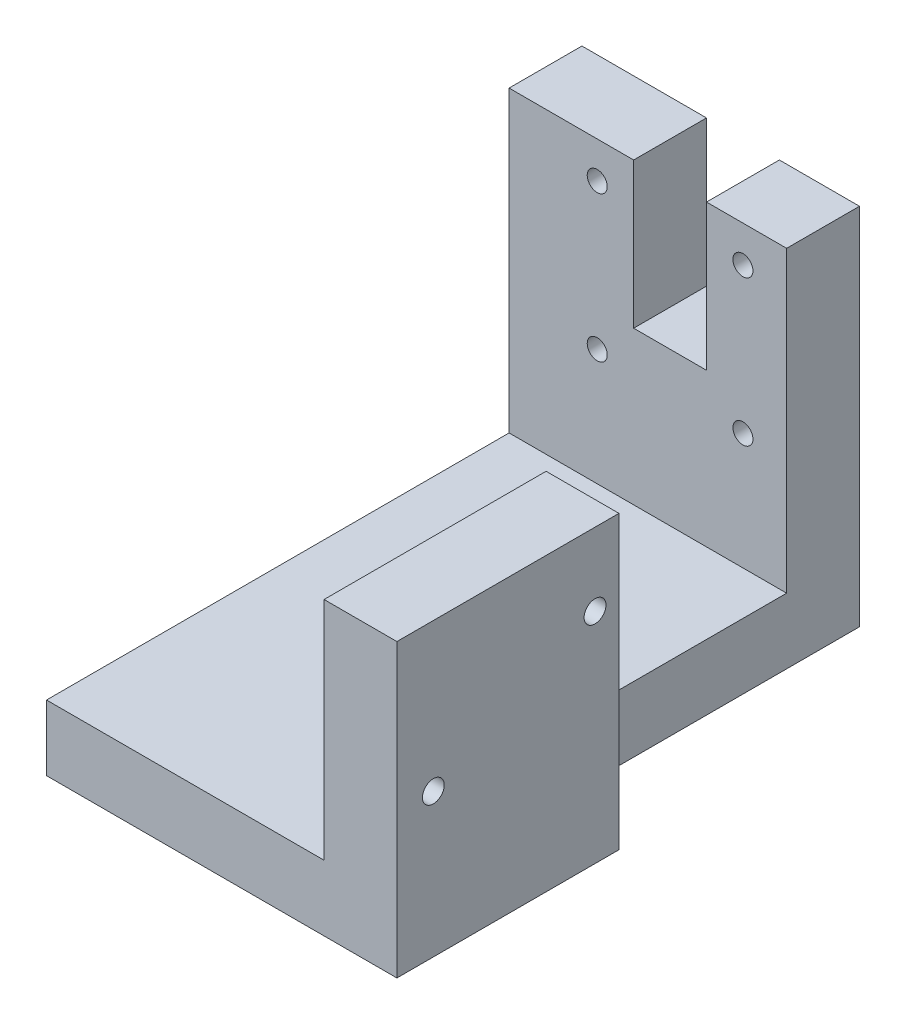
ISO-10303-21;
HEADER;
FILE_DESCRIPTION(('STEP AP214'),'2;1');
FILE_NAME('part.step','',(''),(''),'','','');
FILE_SCHEMA(('AUTOMOTIVE_DESIGN { 1 0 10303 214 1 1 1 1 }'));
ENDSEC;
DATA;
#1=APPLICATION_CONTEXT('core data for automotive mechanical design processes');
#2=APPLICATION_PROTOCOL_DEFINITION('international standard','automotive_design',2000,#1);
#3=PRODUCT_CONTEXT('',#1,'mechanical');
#4=PRODUCT('Part','Part','',(#3));
#5=PRODUCT_RELATED_PRODUCT_CATEGORY('part','',(#4));
#6=PRODUCT_DEFINITION_FORMATION('','',#4);
#7=PRODUCT_DEFINITION_CONTEXT('part definition',#1,'design');
#8=PRODUCT_DEFINITION('design','',#6,#7);
#9=PRODUCT_DEFINITION_SHAPE('','',#8);
#10=(LENGTH_UNIT() NAMED_UNIT(*) SI_UNIT(.MILLI.,.METRE.));
#11=(NAMED_UNIT(*) PLANE_ANGLE_UNIT() SI_UNIT($,.RADIAN.));
#12=(NAMED_UNIT(*) SI_UNIT($,.STERADIAN.) SOLID_ANGLE_UNIT());
#13=UNCERTAINTY_MEASURE_WITH_UNIT(LENGTH_MEASURE(1.E-05),#10,'distance_accuracy_value','');
#14=(GEOMETRIC_REPRESENTATION_CONTEXT(3) GLOBAL_UNCERTAINTY_ASSIGNED_CONTEXT((#13)) GLOBAL_UNIT_ASSIGNED_CONTEXT((#10,
#11,#12)) REPRESENTATION_CONTEXT('',''));
#15=CARTESIAN_POINT('',(0.,0.,0.));
#16=DIRECTION('',(0.,0.,1.));
#17=DIRECTION('',(1.,0.,0.));
#18=AXIS2_PLACEMENT_3D('',#15,#16,#17);
#19=CARTESIAN_POINT('',(19.05,9.,0.));
#20=DIRECTION('',(1.,0.,0.));
#21=DIRECTION('',(0.,0.,-1.));
#22=AXIS2_PLACEMENT_3D('',#19,#20,#21);
#23=PLANE('',#22);
#24=DIRECTION('',(0.,0.,1.));
#25=VECTOR('',#24,1.);
#26=CARTESIAN_POINT('',(19.05,9.,0.));
#27=LINE('',#26,#25);
#28=CARTESIAN_POINT('',(19.05,9.,-31.75));
#29=VERTEX_POINT('',#28);
#30=CARTESIAN_POINT('',(19.05,9.,1.27000000000001));
#31=VERTEX_POINT('',#30);
#32=EDGE_CURVE('E253',#29,#31,#27,.T.);
#33=ORIENTED_EDGE('',*,*,#32,.T.);
#34=DIRECTION('',(0.,-1.,0.));
#35=VECTOR('',#34,1.);
#36=CARTESIAN_POINT('',(19.05,40.,1.27000000000001));
#37=LINE('',#36,#35);
#38=CARTESIAN_POINT('',(19.05,0.,1.27000000000001));
#39=VERTEX_POINT('',#38);
#40=EDGE_CURVE('E11',#31,#39,#37,.T.);
#41=ORIENTED_EDGE('',*,*,#40,.T.);
#42=DIRECTION('',(0.,0.,1.));
#43=VECTOR('',#42,1.);
#44=CARTESIAN_POINT('',(19.05,0.,0.));
#45=LINE('',#44,#43);
#46=CARTESIAN_POINT('',(19.05,0.,-41.75));
#47=VERTEX_POINT('',#46);
#48=EDGE_CURVE('E264',#47,#39,#45,.T.);
#49=ORIENTED_EDGE('',*,*,#48,.F.);
#50=DIRECTION('',(0.,1.,0.));
#51=VECTOR('',#50,1.);
#52=CARTESIAN_POINT('',(19.05,0.,-41.75));
#53=LINE('',#52,#51);
#54=CARTESIAN_POINT('',(19.05,50.,-41.75));
#55=VERTEX_POINT('',#54);
#56=EDGE_CURVE('E173',#47,#55,#53,.T.);
#57=ORIENTED_EDGE('',*,*,#56,.T.);
#58=DIRECTION('',(0.,0.,1.));
#59=VECTOR('',#58,1.);
#60=CARTESIAN_POINT('',(19.05,50.,-41.75));
#61=LINE('',#60,#59);
#62=CARTESIAN_POINT('',(19.05,50.,-31.75));
#63=VERTEX_POINT('',#62);
#64=EDGE_CURVE('E212',#55,#63,#61,.T.);
#65=ORIENTED_EDGE('',*,*,#64,.T.);
#66=DIRECTION('',(0.,1.,0.));
#67=VECTOR('',#66,1.);
#68=CARTESIAN_POINT('',(19.05,0.,-31.75));
#69=LINE('',#68,#67);
#70=EDGE_CURVE('E202',#29,#63,#69,.T.);
#71=ORIENTED_EDGE('',*,*,#70,.F.);
#72=EDGE_LOOP('',(#33,#41,#49,#57,#65,#71));
#73=FACE_BOUND('',#72,.T.);
#74=ADVANCED_FACE('F35',(#73),#23,.T.);
#75=CARTESIAN_POINT('',(-19.05,9.,0.));
#76=DIRECTION('',(1.,0.,0.));
#77=DIRECTION('',(0.,0.,-1.));
#78=AXIS2_PLACEMENT_3D('',#75,#76,#77);
#79=PLANE('',#78);
#80=DIRECTION('',(0.,0.,1.));
#81=VECTOR('',#80,1.);
#82=CARTESIAN_POINT('',(-19.05,0.,0.));
#83=LINE('',#82,#81);
#84=CARTESIAN_POINT('',(-19.05,0.,-41.75));
#85=VERTEX_POINT('',#84);
#86=CARTESIAN_POINT('',(-19.05,0.,31.75));
#87=VERTEX_POINT('',#86);
#88=EDGE_CURVE('E267',#85,#87,#83,.T.);
#89=ORIENTED_EDGE('',*,*,#88,.T.);
#90=DIRECTION('',(0.,-1.,0.));
#91=VECTOR('',#90,1.);
#92=CARTESIAN_POINT('',(-19.05,9.,31.75));
#93=LINE('',#92,#91);
#94=CARTESIAN_POINT('',(-19.05,9.,31.75));
#95=VERTEX_POINT('',#94);
#96=EDGE_CURVE('E39',#95,#87,#93,.T.);
#97=ORIENTED_EDGE('',*,*,#96,.F.);
#98=DIRECTION('',(0.,0.,1.));
#99=VECTOR('',#98,1.);
#100=CARTESIAN_POINT('',(-19.05,9.,0.));
#101=LINE('',#100,#99);
#102=CARTESIAN_POINT('',(-19.05,9.,-31.75));
#103=VERTEX_POINT('',#102);
#104=EDGE_CURVE('E259',#103,#95,#101,.T.);
#105=ORIENTED_EDGE('',*,*,#104,.F.);
#106=DIRECTION('',(0.,1.,0.));
#107=VECTOR('',#106,1.);
#108=CARTESIAN_POINT('',(-19.05,0.,-31.75));
#109=LINE('',#108,#107);
#110=CARTESIAN_POINT('',(-19.05,50.,-31.75));
#111=VERTEX_POINT('',#110);
#112=EDGE_CURVE('E205',#103,#111,#109,.T.);
#113=ORIENTED_EDGE('',*,*,#112,.T.);
#114=DIRECTION('',(0.,0.,1.));
#115=VECTOR('',#114,1.);
#116=CARTESIAN_POINT('',(-19.05,50.,-41.75));
#117=LINE('',#116,#115);
#118=CARTESIAN_POINT('',(-19.05,50.,-41.75));
#119=VERTEX_POINT('',#118);
#120=EDGE_CURVE('E209',#119,#111,#117,.T.);
#121=ORIENTED_EDGE('',*,*,#120,.F.);
#122=DIRECTION('',(0.,1.,0.));
#123=VECTOR('',#122,1.);
#124=CARTESIAN_POINT('',(-19.05,0.,-41.75));
#125=LINE('',#124,#123);
#126=EDGE_CURVE('E179',#85,#119,#125,.T.);
#127=ORIENTED_EDGE('',*,*,#126,.F.);
#128=EDGE_LOOP('',(#89,#97,#105,#113,#121,#127));
#129=FACE_BOUND('',#128,.T.);
#130=ADVANCED_FACE('F316',(#129),#79,.F.);
#131=CARTESIAN_POINT('',(0.,9.,6.35));
#132=DIRECTION('',(0.,-1.,0.));
#133=DIRECTION('',(0.,0.,-1.));
#134=AXIS2_PLACEMENT_3D('',#131,#132,#133);
#135=CYLINDRICAL_SURFACE('',#134,4.064);
#136=CARTESIAN_POINT('',(0.,9.,6.35));
#137=DIRECTION('',(0.,1.,0.));
#138=DIRECTION('',(0.,0.,1.));
#139=AXIS2_PLACEMENT_3D('',#136,#137,#138);
#140=CIRCLE('',#139,4.064);
#141=CARTESIAN_POINT('',(0.,9.,10.414));
#142=VERTEX_POINT('',#141);
#143=EDGE_CURVE('E249',#142,#142,#140,.T.);
#144=ORIENTED_EDGE('',*,*,#143,.T.);
#145=EDGE_LOOP('',(#144));
#146=FACE_BOUND('',#145,.T.);
#147=CARTESIAN_POINT('',(0.,0.,6.35));
#148=DIRECTION('',(0.,1.,0.));
#149=DIRECTION('',(0.,0.,1.));
#150=AXIS2_PLACEMENT_3D('',#147,#148,#149);
#151=CIRCLE('',#150,4.064);
#152=CARTESIAN_POINT('',(0.,0.,10.414));
#153=VERTEX_POINT('',#152);
#154=EDGE_CURVE('E248',#153,#153,#151,.T.);
#155=ORIENTED_EDGE('',*,*,#154,.F.);
#156=EDGE_LOOP('',(#155));
#157=FACE_BOUND('',#156,.T.);
#158=ADVANCED_FACE('F37',(#146,#157),#135,.F.);
#159=CARTESIAN_POINT('',(0.,9.,31.75));
#160=DIRECTION('',(0.,0.,-1.));
#161=DIRECTION('',(-1.,0.,0.));
#162=AXIS2_PLACEMENT_3D('',#159,#160,#161);
#163=PLANE('',#162);
#164=DIRECTION('',(1.,0.,0.));
#165=VECTOR('',#164,1.);
#166=CARTESIAN_POINT('',(0.,0.,31.75));
#167=LINE('',#166,#165);
#168=CARTESIAN_POINT('',(29.05,0.,31.75));
#169=VERTEX_POINT('',#168);
#170=EDGE_CURVE('E72',#87,#169,#167,.T.);
#171=ORIENTED_EDGE('',*,*,#170,.T.);
#172=DIRECTION('',(0.,-1.,0.));
#173=VECTOR('',#172,1.);
#174=CARTESIAN_POINT('',(29.05,40.,31.75));
#175=LINE('',#174,#173);
#176=CARTESIAN_POINT('',(29.05,40.,31.75));
#177=VERTEX_POINT('',#176);
#178=EDGE_CURVE('E239',#177,#169,#175,.T.);
#179=ORIENTED_EDGE('',*,*,#178,.F.);
#180=DIRECTION('',(1.,0.,0.));
#181=VECTOR('',#180,1.);
#182=CARTESIAN_POINT('',(0.,40.,31.75));
#183=LINE('',#182,#181);
#184=CARTESIAN_POINT('',(19.05,40.,31.75));
#185=VERTEX_POINT('',#184);
#186=EDGE_CURVE('E237',#185,#177,#183,.T.);
#187=ORIENTED_EDGE('',*,*,#186,.F.);
#188=DIRECTION('',(0.,-1.,0.));
#189=VECTOR('',#188,1.);
#190=CARTESIAN_POINT('',(19.05,40.,31.75));
#191=LINE('',#190,#189);
#192=CARTESIAN_POINT('',(19.05,9.,31.75));
#193=VERTEX_POINT('',#192);
#194=EDGE_CURVE('E244',#185,#193,#191,.T.);
#195=ORIENTED_EDGE('',*,*,#194,.T.);
#196=DIRECTION('',(1.,0.,0.));
#197=VECTOR('',#196,1.);
#198=CARTESIAN_POINT('',(0.,9.,31.75));
#199=LINE('',#198,#197);
#200=EDGE_CURVE('E60',#95,#193,#199,.T.);
#201=ORIENTED_EDGE('',*,*,#200,.F.);
#202=ORIENTED_EDGE('',*,*,#96,.T.);
#203=EDGE_LOOP('',(#171,#179,#187,#195,#201,#202));
#204=FACE_BOUND('',#203,.T.);
#205=ADVANCED_FACE('F270',(#204),#163,.F.);
#206=CARTESIAN_POINT('',(0.,9.,0.));
#207=DIRECTION('',(0.,1.,0.));
#208=DIRECTION('',(0.,0.,1.));
#209=AXIS2_PLACEMENT_3D('',#206,#207,#208);
#210=PLANE('',#209);
#211=ORIENTED_EDGE('',*,*,#143,.F.);
#212=EDGE_LOOP('',(#211));
#213=FACE_BOUND('',#212,.T.);
#214=ORIENTED_EDGE('',*,*,#32,.F.);
#215=DIRECTION('',(1.,0.,0.));
#216=VECTOR('',#215,1.);
#217=CARTESIAN_POINT('',(0.,9.,-31.75));
#218=LINE('',#217,#216);
#219=EDGE_CURVE('E256',#103,#29,#218,.T.);
#220=ORIENTED_EDGE('',*,*,#219,.F.);
#221=ORIENTED_EDGE('',*,*,#104,.T.);
#222=ORIENTED_EDGE('',*,*,#200,.T.);
#223=EDGE_CURVE('E252',#31,#193,#27,.T.);
#224=ORIENTED_EDGE('',*,*,#223,.F.);
#225=EDGE_LOOP('',(#214,#220,#221,#222,#224));
#226=FACE_BOUND('',#225,.T.);
#227=ADVANCED_FACE('F294',(#213,#226),#210,.T.);
#228=CARTESIAN_POINT('',(0.,0.,0.));
#229=DIRECTION('',(0.,1.,0.));
#230=DIRECTION('',(0.,0.,1.));
#231=AXIS2_PLACEMENT_3D('',#228,#229,#230);
#232=PLANE('',#231);
#233=ORIENTED_EDGE('',*,*,#154,.T.);
#234=EDGE_LOOP('',(#233));
#235=FACE_BOUND('',#234,.T.);
#236=ORIENTED_EDGE('',*,*,#48,.T.);
#237=DIRECTION('',(-1.,0.,0.));
#238=VECTOR('',#237,1.);
#239=CARTESIAN_POINT('',(0.,0.,1.27000000000001));
#240=LINE('',#239,#238);
#241=CARTESIAN_POINT('',(29.05,0.,1.27));
#242=VERTEX_POINT('',#241);
#243=EDGE_CURVE('E52',#242,#39,#240,.T.);
#244=ORIENTED_EDGE('',*,*,#243,.F.);
#245=DIRECTION('',(0.,0.,1.));
#246=VECTOR('',#245,1.);
#247=CARTESIAN_POINT('',(29.05,0.,0.));
#248=LINE('',#247,#246);
#249=EDGE_CURVE('E221',#242,#169,#248,.T.);
#250=ORIENTED_EDGE('',*,*,#249,.T.);
#251=ORIENTED_EDGE('',*,*,#170,.F.);
#252=ORIENTED_EDGE('',*,*,#88,.F.);
#253=DIRECTION('',(1.,0.,0.));
#254=VECTOR('',#253,1.);
#255=CARTESIAN_POINT('',(0.,0.,-41.75));
#256=LINE('',#255,#254);
#257=EDGE_CURVE('E176',#85,#47,#256,.T.);
#258=ORIENTED_EDGE('',*,*,#257,.T.);
#259=EDGE_LOOP('',(#236,#244,#250,#251,#252,#258));
#260=FACE_BOUND('',#259,.T.);
#261=ADVANCED_FACE('F277',(#235,#260),#232,.F.);
#262=CARTESIAN_POINT('',(19.05,40.,0.));
#263=DIRECTION('',(1.,0.,0.));
#264=DIRECTION('',(0.,0.,-1.));
#265=AXIS2_PLACEMENT_3D('',#262,#263,#264);
#266=PLANE('',#265);
#267=CARTESIAN_POINT('',(19.05,19.7,26.75));
#268=DIRECTION('',(1.,0.,0.));
#269=DIRECTION('',(0.,0.,-1.));
#270=AXIS2_PLACEMENT_3D('',#267,#268,#269);
#271=CIRCLE('',#270,1.5);
#272=CARTESIAN_POINT('',(19.05,19.7,25.25));
#273=VERTEX_POINT('',#272);
#274=EDGE_CURVE('E218',#273,#273,#271,.T.);
#275=ORIENTED_EDGE('',*,*,#274,.T.);
#276=EDGE_LOOP('',(#275));
#277=FACE_BOUND('',#276,.T.);
#278=CARTESIAN_POINT('',(19.05,30.,4.54999999999999));
#279=DIRECTION('',(1.,0.,0.));
#280=DIRECTION('',(0.,0.,-1.));
#281=AXIS2_PLACEMENT_3D('',#278,#279,#280);
#282=CIRCLE('',#281,1.5);
#283=CARTESIAN_POINT('',(19.05,30.,3.04999999999999));
#284=VERTEX_POINT('',#283);
#285=EDGE_CURVE('E225',#284,#284,#282,.T.);
#286=ORIENTED_EDGE('',*,*,#285,.T.);
#287=EDGE_LOOP('',(#286));
#288=FACE_BOUND('',#287,.T.);
#289=CARTESIAN_POINT('',(19.05,40.,1.27000000000001));
#290=VERTEX_POINT('',#289);
#291=EDGE_CURVE('E45',#290,#31,#37,.T.);
#292=ORIENTED_EDGE('',*,*,#291,.T.);
#293=ORIENTED_EDGE('',*,*,#223,.T.);
#294=ORIENTED_EDGE('',*,*,#194,.F.);
#295=DIRECTION('',(0.,0.,1.));
#296=VECTOR('',#295,1.);
#297=CARTESIAN_POINT('',(19.05,40.,0.));
#298=LINE('',#297,#296);
#299=EDGE_CURVE('E235',#290,#185,#298,.T.);
#300=ORIENTED_EDGE('',*,*,#299,.F.);
#301=EDGE_LOOP('',(#292,#293,#294,#300));
#302=FACE_BOUND('',#301,.T.);
#303=ADVANCED_FACE('F298',(#277,#288,#302),#266,.F.);
#304=CARTESIAN_POINT('',(29.05,40.,0.));
#305=DIRECTION('',(1.,0.,0.));
#306=DIRECTION('',(0.,0.,-1.));
#307=AXIS2_PLACEMENT_3D('',#304,#305,#306);
#308=PLANE('',#307);
#309=CARTESIAN_POINT('',(29.05,19.7,26.75));
#310=DIRECTION('',(1.,0.,0.));
#311=DIRECTION('',(0.,0.,-1.));
#312=AXIS2_PLACEMENT_3D('',#309,#310,#311);
#313=CIRCLE('',#312,1.5);
#314=CARTESIAN_POINT('',(29.05,19.7,25.25));
#315=VERTEX_POINT('',#314);
#316=EDGE_CURVE('E222',#315,#315,#313,.T.);
#317=ORIENTED_EDGE('',*,*,#316,.F.);
#318=EDGE_LOOP('',(#317));
#319=FACE_BOUND('',#318,.T.);
#320=CARTESIAN_POINT('',(29.05,30.,4.54999999999999));
#321=DIRECTION('',(1.,0.,0.));
#322=DIRECTION('',(0.,0.,-1.));
#323=AXIS2_PLACEMENT_3D('',#320,#321,#322);
#324=CIRCLE('',#323,1.5);
#325=CARTESIAN_POINT('',(29.05,30.,3.04999999999999));
#326=VERTEX_POINT('',#325);
#327=EDGE_CURVE('E151',#326,#326,#324,.T.);
#328=ORIENTED_EDGE('',*,*,#327,.F.);
#329=EDGE_LOOP('',(#328));
#330=FACE_BOUND('',#329,.T.);
#331=ORIENTED_EDGE('',*,*,#249,.F.);
#332=DIRECTION('',(0.,-1.,0.));
#333=VECTOR('',#332,1.);
#334=CARTESIAN_POINT('',(29.05,40.,1.27));
#335=LINE('',#334,#333);
#336=CARTESIAN_POINT('',(29.05,40.,1.27));
#337=VERTEX_POINT('',#336);
#338=EDGE_CURVE('E246',#337,#242,#335,.T.);
#339=ORIENTED_EDGE('',*,*,#338,.F.);
#340=DIRECTION('',(0.,0.,1.));
#341=VECTOR('',#340,1.);
#342=CARTESIAN_POINT('',(29.05,40.,0.));
#343=LINE('',#342,#341);
#344=EDGE_CURVE('E230',#337,#177,#343,.T.);
#345=ORIENTED_EDGE('',*,*,#344,.T.);
#346=ORIENTED_EDGE('',*,*,#178,.T.);
#347=EDGE_LOOP('',(#331,#339,#345,#346));
#348=FACE_BOUND('',#347,.T.);
#349=ADVANCED_FACE('F275',(#319,#330,#348),#308,.T.);
#350=CARTESIAN_POINT('',(0.,40.,1.27000000000001));
#351=DIRECTION('',(0.,0.,1.));
#352=DIRECTION('',(1.,0.,0.));
#353=AXIS2_PLACEMENT_3D('',#350,#351,#352);
#354=PLANE('',#353);
#355=ORIENTED_EDGE('',*,*,#243,.T.);
#356=ORIENTED_EDGE('',*,*,#40,.F.);
#357=ORIENTED_EDGE('',*,*,#291,.F.);
#358=DIRECTION('',(-1.,0.,0.));
#359=VECTOR('',#358,1.);
#360=CARTESIAN_POINT('',(0.,40.,1.27000000000001));
#361=LINE('',#360,#359);
#362=EDGE_CURVE('E233',#337,#290,#361,.T.);
#363=ORIENTED_EDGE('',*,*,#362,.F.);
#364=ORIENTED_EDGE('',*,*,#338,.T.);
#365=EDGE_LOOP('',(#355,#356,#357,#363,#364));
#366=FACE_BOUND('',#365,.T.);
#367=ADVANCED_FACE('F303',(#366),#354,.F.);
#368=CARTESIAN_POINT('',(0.,40.,0.));
#369=DIRECTION('',(0.,1.,0.));
#370=DIRECTION('',(0.,0.,1.));
#371=AXIS2_PLACEMENT_3D('',#368,#369,#370);
#372=PLANE('',#371);
#373=ORIENTED_EDGE('',*,*,#344,.F.);
#374=ORIENTED_EDGE('',*,*,#362,.T.);
#375=ORIENTED_EDGE('',*,*,#299,.T.);
#376=ORIENTED_EDGE('',*,*,#186,.T.);
#377=EDGE_LOOP('',(#373,#374,#375,#376));
#378=FACE_BOUND('',#377,.T.);
#379=ADVANCED_FACE('F301',(#378),#372,.T.);
#380=CARTESIAN_POINT('',(19.05,30.,4.54999999999999));
#381=DIRECTION('',(1.,0.,0.));
#382=DIRECTION('',(0.,0.,-1.));
#383=AXIS2_PLACEMENT_3D('',#380,#381,#382);
#384=CYLINDRICAL_SURFACE('',#383,1.5);
#385=ORIENTED_EDGE('',*,*,#285,.F.);
#386=EDGE_LOOP('',(#385));
#387=FACE_BOUND('',#386,.T.);
#388=ORIENTED_EDGE('',*,*,#327,.T.);
#389=EDGE_LOOP('',(#388));
#390=FACE_BOUND('',#389,.T.);
#391=ADVANCED_FACE('F310',(#387,#390),#384,.F.);
#392=CARTESIAN_POINT('',(19.05,19.7,26.75));
#393=DIRECTION('',(1.,0.,0.));
#394=DIRECTION('',(0.,0.,-1.));
#395=AXIS2_PLACEMENT_3D('',#392,#393,#394);
#396=CYLINDRICAL_SURFACE('',#395,1.5);
#397=ORIENTED_EDGE('',*,*,#274,.F.);
#398=EDGE_LOOP('',(#397));
#399=FACE_BOUND('',#398,.T.);
#400=ORIENTED_EDGE('',*,*,#316,.T.);
#401=EDGE_LOOP('',(#400));
#402=FACE_BOUND('',#401,.T.);
#403=ADVANCED_FACE('F382',(#399,#402),#396,.F.);
#404=CARTESIAN_POINT('',(0.,0.,-31.75));
#405=DIRECTION('',(0.,0.,-1.));
#406=DIRECTION('',(-1.,0.,0.));
#407=AXIS2_PLACEMENT_3D('',#404,#405,#406);
#408=PLANE('',#407);
#409=CARTESIAN_POINT('',(-6.95,25.,-31.75));
#410=DIRECTION('',(0.,0.,-1.));
#411=DIRECTION('',(-1.,0.,0.));
#412=AXIS2_PLACEMENT_3D('',#409,#410,#411);
#413=CIRCLE('',#412,1.375);
#414=CARTESIAN_POINT('',(-8.325,25.,-31.75));
#415=VERTEX_POINT('',#414);
#416=EDGE_CURVE('E181',#415,#415,#413,.T.);
#417=ORIENTED_EDGE('',*,*,#416,.T.);
#418=EDGE_LOOP('',(#417));
#419=FACE_BOUND('',#418,.T.);
#420=CARTESIAN_POINT('',(13.05,25.,-31.75));
#421=DIRECTION('',(0.,0.,-1.));
#422=DIRECTION('',(-1.,0.,0.));
#423=AXIS2_PLACEMENT_3D('',#420,#421,#422);
#424=CIRCLE('',#423,1.375);
#425=CARTESIAN_POINT('',(11.675,25.,-31.75));
#426=VERTEX_POINT('',#425);
#427=EDGE_CURVE('E184',#426,#426,#424,.T.);
#428=ORIENTED_EDGE('',*,*,#427,.T.);
#429=EDGE_LOOP('',(#428));
#430=FACE_BOUND('',#429,.T.);
#431=CARTESIAN_POINT('',(-6.95,45.,-31.75));
#432=DIRECTION('',(0.,0.,-1.));
#433=DIRECTION('',(-1.,0.,0.));
#434=AXIS2_PLACEMENT_3D('',#431,#432,#433);
#435=CIRCLE('',#434,1.375);
#436=CARTESIAN_POINT('',(-8.325,45.,-31.75));
#437=VERTEX_POINT('',#436);
#438=EDGE_CURVE('E187',#437,#437,#435,.T.);
#439=ORIENTED_EDGE('',*,*,#438,.T.);
#440=EDGE_LOOP('',(#439));
#441=FACE_BOUND('',#440,.T.);
#442=CARTESIAN_POINT('',(13.05,45.,-31.75));
#443=DIRECTION('',(0.,0.,-1.));
#444=DIRECTION('',(-1.,0.,0.));
#445=AXIS2_PLACEMENT_3D('',#442,#443,#444);
#446=CIRCLE('',#445,1.375);
#447=CARTESIAN_POINT('',(11.675,45.,-31.75));
#448=VERTEX_POINT('',#447);
#449=EDGE_CURVE('E190',#448,#448,#446,.T.);
#450=ORIENTED_EDGE('',*,*,#449,.T.);
#451=EDGE_LOOP('',(#450));
#452=FACE_BOUND('',#451,.T.);
#453=ORIENTED_EDGE('',*,*,#112,.F.);
#454=ORIENTED_EDGE('',*,*,#219,.T.);
#455=ORIENTED_EDGE('',*,*,#70,.T.);
#456=DIRECTION('',(1.,0.,0.));
#457=VECTOR('',#456,1.);
#458=CARTESIAN_POINT('',(0.,50.,-31.75));
#459=LINE('',#458,#457);
#460=CARTESIAN_POINT('',(8.05,50.,-31.75));
#461=VERTEX_POINT('',#460);
#462=EDGE_CURVE('E199',#461,#63,#459,.T.);
#463=ORIENTED_EDGE('',*,*,#462,.F.);
#464=DIRECTION('',(0.,-1.,0.));
#465=VECTOR('',#464,1.);
#466=CARTESIAN_POINT('',(8.05,0.,-31.75));
#467=LINE('',#466,#465);
#468=CARTESIAN_POINT('',(8.05,30.,-31.75));
#469=VERTEX_POINT('',#468);
#470=EDGE_CURVE('E196',#461,#469,#467,.T.);
#471=ORIENTED_EDGE('',*,*,#470,.T.);
#472=DIRECTION('',(-1.,0.,0.));
#473=VECTOR('',#472,1.);
#474=CARTESIAN_POINT('',(0.,30.,-31.75));
#475=LINE('',#474,#473);
#476=CARTESIAN_POINT('',(-1.95,30.,-31.75));
#477=VERTEX_POINT('',#476);
#478=EDGE_CURVE('E194',#469,#477,#475,.T.);
#479=ORIENTED_EDGE('',*,*,#478,.T.);
#480=DIRECTION('',(0.,1.,0.));
#481=VECTOR('',#480,1.);
#482=CARTESIAN_POINT('',(-1.94999999999999,0.,-31.75));
#483=LINE('',#482,#481);
#484=CARTESIAN_POINT('',(-1.95,50.,-31.75));
#485=VERTEX_POINT('',#484);
#486=EDGE_CURVE('E146',#477,#485,#483,.T.);
#487=ORIENTED_EDGE('',*,*,#486,.T.);
#488=EDGE_CURVE('E203',#111,#485,#459,.T.);
#489=ORIENTED_EDGE('',*,*,#488,.F.);
#490=EDGE_LOOP('',(#453,#454,#455,#463,#471,#479,#487,#489));
#491=FACE_BOUND('',#490,.T.);
#492=ADVANCED_FACE('F289',(#419,#430,#441,#452,#491),#408,.F.);
#493=CARTESIAN_POINT('',(-1.94999999999999,0.,-41.75));
#494=DIRECTION('',(1.,0.,0.));
#495=DIRECTION('',(0.,1.,0.));
#496=AXIS2_PLACEMENT_3D('',#493,#494,#495);
#497=PLANE('',#496);
#498=ORIENTED_EDGE('',*,*,#486,.F.);
#499=DIRECTION('',(0.,0.,1.));
#500=VECTOR('',#499,1.);
#501=CARTESIAN_POINT('',(-1.95,30.,-41.75));
#502=LINE('',#501,#500);
#503=CARTESIAN_POINT('',(-1.95,30.,-41.75));
#504=VERTEX_POINT('',#503);
#505=EDGE_CURVE('E141',#504,#477,#502,.T.);
#506=ORIENTED_EDGE('',*,*,#505,.F.);
#507=DIRECTION('',(0.,1.,0.));
#508=VECTOR('',#507,1.);
#509=CARTESIAN_POINT('',(-1.94999999999999,0.,-41.75));
#510=LINE('',#509,#508);
#511=CARTESIAN_POINT('',(-1.95,50.,-41.75));
#512=VERTEX_POINT('',#511);
#513=EDGE_CURVE('E144',#504,#512,#510,.T.);
#514=ORIENTED_EDGE('',*,*,#513,.T.);
#515=DIRECTION('',(0.,0.,1.));
#516=VECTOR('',#515,1.);
#517=CARTESIAN_POINT('',(-1.95,50.,-41.75));
#518=LINE('',#517,#516);
#519=EDGE_CURVE('E207',#512,#485,#518,.T.);
#520=ORIENTED_EDGE('',*,*,#519,.T.);
#521=EDGE_LOOP('',(#498,#506,#514,#520));
#522=FACE_BOUND('',#521,.T.);
#523=ADVANCED_FACE('F143',(#522),#497,.T.);
#524=CARTESIAN_POINT('',(0.,30.,-41.75));
#525=DIRECTION('',(0.,1.,0.));
#526=DIRECTION('',(0.,0.,1.));
#527=AXIS2_PLACEMENT_3D('',#524,#525,#526);
#528=PLANE('',#527);
#529=ORIENTED_EDGE('',*,*,#478,.F.);
#530=DIRECTION('',(0.,0.,1.));
#531=VECTOR('',#530,1.);
#532=CARTESIAN_POINT('',(8.05,30.,-41.75));
#533=LINE('',#532,#531);
#534=CARTESIAN_POINT('',(8.05,30.,-41.75));
#535=VERTEX_POINT('',#534);
#536=EDGE_CURVE('E152',#535,#469,#533,.T.);
#537=ORIENTED_EDGE('',*,*,#536,.F.);
#538=DIRECTION('',(-1.,0.,0.));
#539=VECTOR('',#538,1.);
#540=CARTESIAN_POINT('',(0.,30.,-41.75));
#541=LINE('',#540,#539);
#542=EDGE_CURVE('E158',#535,#504,#541,.T.);
#543=ORIENTED_EDGE('',*,*,#542,.T.);
#544=ORIENTED_EDGE('',*,*,#505,.T.);
#545=EDGE_LOOP('',(#529,#537,#543,#544));
#546=FACE_BOUND('',#545,.T.);
#547=ADVANCED_FACE('F165',(#546),#528,.T.);
#548=CARTESIAN_POINT('',(8.05,0.,-41.75));
#549=DIRECTION('',(-1.,0.,0.));
#550=DIRECTION('',(0.,-1.,0.));
#551=AXIS2_PLACEMENT_3D('',#548,#549,#550);
#552=PLANE('',#551);
#553=ORIENTED_EDGE('',*,*,#470,.F.);
#554=DIRECTION('',(0.,0.,1.));
#555=VECTOR('',#554,1.);
#556=CARTESIAN_POINT('',(8.05,50.,-41.75));
#557=LINE('',#556,#555);
#558=CARTESIAN_POINT('',(8.05,50.,-41.75));
#559=VERTEX_POINT('',#558);
#560=EDGE_CURVE('E215',#559,#461,#557,.T.);
#561=ORIENTED_EDGE('',*,*,#560,.F.);
#562=DIRECTION('',(0.,-1.,0.));
#563=VECTOR('',#562,1.);
#564=CARTESIAN_POINT('',(8.05,0.,-41.75));
#565=LINE('',#564,#563);
#566=EDGE_CURVE('E166',#559,#535,#565,.T.);
#567=ORIENTED_EDGE('',*,*,#566,.T.);
#568=ORIENTED_EDGE('',*,*,#536,.T.);
#569=EDGE_LOOP('',(#553,#561,#567,#568));
#570=FACE_BOUND('',#569,.T.);
#571=ADVANCED_FACE('F438',(#570),#552,.T.);
#572=CARTESIAN_POINT('',(0.,50.,-41.75));
#573=DIRECTION('',(0.,-1.,0.));
#574=DIRECTION('',(1.,0.,0.));
#575=AXIS2_PLACEMENT_3D('',#572,#573,#574);
#576=PLANE('',#575);
#577=ORIENTED_EDGE('',*,*,#462,.T.);
#578=ORIENTED_EDGE('',*,*,#64,.F.);
#579=DIRECTION('',(1.,0.,0.));
#580=VECTOR('',#579,1.);
#581=CARTESIAN_POINT('',(0.,50.,-41.75));
#582=LINE('',#581,#580);
#583=EDGE_CURVE('E168',#559,#55,#582,.T.);
#584=ORIENTED_EDGE('',*,*,#583,.F.);
#585=ORIENTED_EDGE('',*,*,#560,.T.);
#586=EDGE_LOOP('',(#577,#578,#584,#585));
#587=FACE_BOUND('',#586,.T.);
#588=ADVANCED_FACE('F284',(#587),#576,.F.);
#589=CARTESIAN_POINT('',(13.05,45.,-41.75));
#590=DIRECTION('',(0.,0.,1.));
#591=DIRECTION('',(1.,0.,0.));
#592=AXIS2_PLACEMENT_3D('',#589,#590,#591);
#593=CYLINDRICAL_SURFACE('',#592,1.375);
#594=CARTESIAN_POINT('',(13.05,45.,-41.75));
#595=DIRECTION('',(0.,0.,-1.));
#596=DIRECTION('',(-1.,0.,0.));
#597=AXIS2_PLACEMENT_3D('',#594,#595,#596);
#598=CIRCLE('',#597,1.375);
#599=CARTESIAN_POINT('',(11.675,45.,-41.75));
#600=VERTEX_POINT('',#599);
#601=EDGE_CURVE('E163',#600,#600,#598,.T.);
#602=ORIENTED_EDGE('',*,*,#601,.T.);
#603=EDGE_LOOP('',(#602));
#604=FACE_BOUND('',#603,.T.);
#605=ORIENTED_EDGE('',*,*,#449,.F.);
#606=EDGE_LOOP('',(#605));
#607=FACE_BOUND('',#606,.T.);
#608=ADVANCED_FACE('F456',(#604,#607),#593,.F.);
#609=CARTESIAN_POINT('',(-6.95,45.,-41.75));
#610=DIRECTION('',(0.,0.,1.));
#611=DIRECTION('',(1.,0.,0.));
#612=AXIS2_PLACEMENT_3D('',#609,#610,#611);
#613=CYLINDRICAL_SURFACE('',#612,1.375);
#614=CARTESIAN_POINT('',(-6.95,45.,-41.75));
#615=DIRECTION('',(0.,0.,-1.));
#616=DIRECTION('',(-1.,0.,0.));
#617=AXIS2_PLACEMENT_3D('',#614,#615,#616);
#618=CIRCLE('',#617,1.375);
#619=CARTESIAN_POINT('',(-8.325,45.,-41.75));
#620=VERTEX_POINT('',#619);
#621=EDGE_CURVE('E528',#620,#620,#618,.T.);
#622=ORIENTED_EDGE('',*,*,#621,.T.);
#623=EDGE_LOOP('',(#622));
#624=FACE_BOUND('',#623,.T.);
#625=ORIENTED_EDGE('',*,*,#438,.F.);
#626=EDGE_LOOP('',(#625));
#627=FACE_BOUND('',#626,.T.);
#628=ADVANCED_FACE('F466',(#624,#627),#613,.F.);
#629=CARTESIAN_POINT('',(13.05,25.,-41.75));
#630=DIRECTION('',(0.,0.,1.));
#631=DIRECTION('',(1.,0.,0.));
#632=AXIS2_PLACEMENT_3D('',#629,#630,#631);
#633=CYLINDRICAL_SURFACE('',#632,1.375);
#634=CARTESIAN_POINT('',(13.05,25.,-41.75));
#635=DIRECTION('',(0.,0.,-1.));
#636=DIRECTION('',(-1.,0.,0.));
#637=AXIS2_PLACEMENT_3D('',#634,#635,#636);
#638=CIRCLE('',#637,1.375);
#639=CARTESIAN_POINT('',(11.675,25.,-41.75));
#640=VERTEX_POINT('',#639);
#641=EDGE_CURVE('E524',#640,#640,#638,.T.);
#642=ORIENTED_EDGE('',*,*,#641,.T.);
#643=EDGE_LOOP('',(#642));
#644=FACE_BOUND('',#643,.T.);
#645=ORIENTED_EDGE('',*,*,#427,.F.);
#646=EDGE_LOOP('',(#645));
#647=FACE_BOUND('',#646,.T.);
#648=ADVANCED_FACE('F476',(#644,#647),#633,.F.);
#649=CARTESIAN_POINT('',(-6.95,25.,-41.75));
#650=DIRECTION('',(0.,0.,1.));
#651=DIRECTION('',(1.,0.,0.));
#652=AXIS2_PLACEMENT_3D('',#649,#650,#651);
#653=CYLINDRICAL_SURFACE('',#652,1.375);
#654=CARTESIAN_POINT('',(-6.95,25.,-41.75));
#655=DIRECTION('',(0.,0.,-1.));
#656=DIRECTION('',(-1.,0.,0.));
#657=AXIS2_PLACEMENT_3D('',#654,#655,#656);
#658=CIRCLE('',#657,1.375);
#659=CARTESIAN_POINT('',(-8.325,25.,-41.75));
#660=VERTEX_POINT('',#659);
#661=EDGE_CURVE('E520',#660,#660,#658,.T.);
#662=ORIENTED_EDGE('',*,*,#661,.T.);
#663=EDGE_LOOP('',(#662));
#664=FACE_BOUND('',#663,.T.);
#665=ORIENTED_EDGE('',*,*,#416,.F.);
#666=EDGE_LOOP('',(#665));
#667=FACE_BOUND('',#666,.T.);
#668=ADVANCED_FACE('F486',(#664,#667),#653,.F.);
#669=ORIENTED_EDGE('',*,*,#488,.T.);
#670=ORIENTED_EDGE('',*,*,#519,.F.);
#671=EDGE_CURVE('E161',#119,#512,#582,.T.);
#672=ORIENTED_EDGE('',*,*,#671,.F.);
#673=ORIENTED_EDGE('',*,*,#120,.T.);
#674=EDGE_LOOP('',(#669,#670,#672,#673));
#675=FACE_BOUND('',#674,.T.);
#676=ADVANCED_FACE('F458',(#675),#576,.F.);
#677=CARTESIAN_POINT('',(0.,0.,-41.75));
#678=DIRECTION('',(0.,0.,-1.));
#679=DIRECTION('',(-1.,0.,0.));
#680=AXIS2_PLACEMENT_3D('',#677,#678,#679);
#681=PLANE('',#680);
#682=ORIENTED_EDGE('',*,*,#661,.F.);
#683=EDGE_LOOP('',(#682));
#684=FACE_BOUND('',#683,.T.);
#685=ORIENTED_EDGE('',*,*,#641,.F.);
#686=EDGE_LOOP('',(#685));
#687=FACE_BOUND('',#686,.T.);
#688=ORIENTED_EDGE('',*,*,#621,.F.);
#689=EDGE_LOOP('',(#688));
#690=FACE_BOUND('',#689,.T.);
#691=ORIENTED_EDGE('',*,*,#601,.F.);
#692=EDGE_LOOP('',(#691));
#693=FACE_BOUND('',#692,.T.);
#694=ORIENTED_EDGE('',*,*,#513,.F.);
#695=ORIENTED_EDGE('',*,*,#542,.F.);
#696=ORIENTED_EDGE('',*,*,#566,.F.);
#697=ORIENTED_EDGE('',*,*,#583,.T.);
#698=ORIENTED_EDGE('',*,*,#56,.F.);
#699=ORIENTED_EDGE('',*,*,#257,.F.);
#700=ORIENTED_EDGE('',*,*,#126,.T.);
#701=ORIENTED_EDGE('',*,*,#671,.T.);
#702=EDGE_LOOP('',(#694,#695,#696,#697,#698,#699,#700,#701));
#703=FACE_BOUND('',#702,.T.);
#704=ADVANCED_FACE('F156',(#684,#687,#690,#693,#703),#681,.T.);
#705=CLOSED_SHELL('',(#74,#130,#158,#205,#227,#261,#303,#349,#367,#379,#391,#403,#492,#523,#547,
#571,#588,#608,#628,#648,#668,#676,#704));
#706=MANIFOLD_SOLID_BREP('B2',#705);
#707=ADVANCED_BREP_SHAPE_REPRESENTATION('',(#18,#706),#14);
#708=SHAPE_DEFINITION_REPRESENTATION(#9,#707);
ENDSEC;
END-ISO-10303-21;
